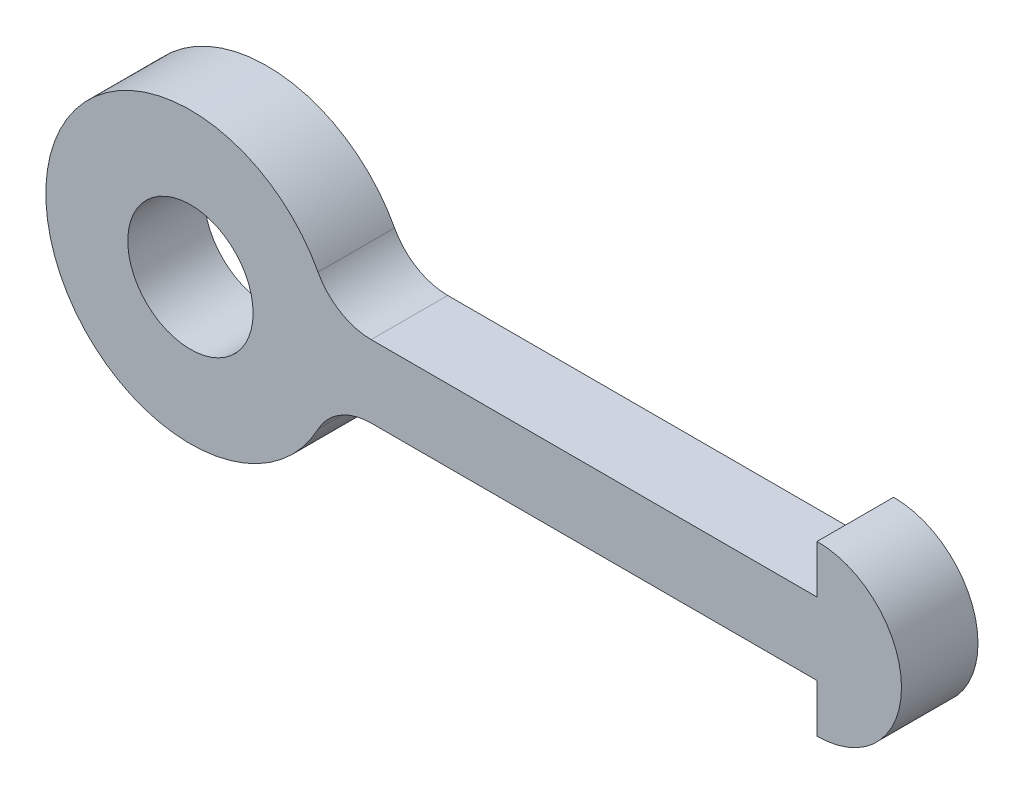
ISO-10303-21;
HEADER;
FILE_DESCRIPTION(('STEP AP214'),'2;1');
FILE_NAME('part.step','',(''),(''),'','','');
FILE_SCHEMA(('AUTOMOTIVE_DESIGN { 1 0 10303 214 1 1 1 1 }'));
ENDSEC;
DATA;
#1=APPLICATION_CONTEXT('core data for automotive mechanical design processes');
#2=APPLICATION_PROTOCOL_DEFINITION('international standard','automotive_design',2000,#1);
#3=PRODUCT_CONTEXT('',#1,'mechanical');
#4=PRODUCT('Part','Part','',(#3));
#5=PRODUCT_RELATED_PRODUCT_CATEGORY('part','',(#4));
#6=PRODUCT_DEFINITION_FORMATION('','',#4);
#7=PRODUCT_DEFINITION_CONTEXT('part definition',#1,'design');
#8=PRODUCT_DEFINITION('design','',#6,#7);
#9=PRODUCT_DEFINITION_SHAPE('','',#8);
#10=(LENGTH_UNIT() NAMED_UNIT(*) SI_UNIT(.MILLI.,.METRE.));
#11=(NAMED_UNIT(*) PLANE_ANGLE_UNIT() SI_UNIT($,.RADIAN.));
#12=(NAMED_UNIT(*) SI_UNIT($,.STERADIAN.) SOLID_ANGLE_UNIT());
#13=UNCERTAINTY_MEASURE_WITH_UNIT(LENGTH_MEASURE(1.E-05),#10,'distance_accuracy_value','');
#14=(GEOMETRIC_REPRESENTATION_CONTEXT(3) GLOBAL_UNCERTAINTY_ASSIGNED_CONTEXT((#13)) GLOBAL_UNIT_ASSIGNED_CONTEXT((#10,
#11,#12)) REPRESENTATION_CONTEXT('',''));
#15=CARTESIAN_POINT('',(0.,0.,0.));
#16=DIRECTION('',(0.,0.,1.));
#17=DIRECTION('',(1.,0.,0.));
#18=AXIS2_PLACEMENT_3D('',#15,#16,#17);
#19=CARTESIAN_POINT('',(10.,0.,1.5875));
#20=DIRECTION('',(1.,0.,0.));
#21=DIRECTION('',(0.,0.,-1.));
#22=AXIS2_PLACEMENT_3D('',#19,#20,#21);
#23=PLANE('',#22);
#24=DIRECTION('',(0.,-1.,0.));
#25=VECTOR('',#24,1.);
#26=CARTESIAN_POINT('',(10.,0.,-1.5875));
#27=LINE('',#26,#25);
#28=CARTESIAN_POINT('',(10.,3.5,-1.5875));
#29=VERTEX_POINT('',#28);
#30=CARTESIAN_POINT('',(10.,1.5,-1.5875));
#31=VERTEX_POINT('',#30);
#32=EDGE_CURVE('E131',#29,#31,#27,.T.);
#33=ORIENTED_EDGE('',*,*,#32,.T.);
#34=DIRECTION('',(0.,0.,-1.));
#35=VECTOR('',#34,1.);
#36=CARTESIAN_POINT('',(10.,1.5,1.5875));
#37=LINE('',#36,#35);
#38=CARTESIAN_POINT('',(10.,1.5,1.5875));
#39=VERTEX_POINT('',#38);
#40=EDGE_CURVE('E110',#39,#31,#37,.T.);
#41=ORIENTED_EDGE('',*,*,#40,.F.);
#42=DIRECTION('',(0.,-1.,0.));
#43=VECTOR('',#42,1.);
#44=CARTESIAN_POINT('',(10.,0.,1.5875));
#45=LINE('',#44,#43);
#46=CARTESIAN_POINT('',(10.,3.5,1.5875));
#47=VERTEX_POINT('',#46);
#48=EDGE_CURVE('E116',#47,#39,#45,.T.);
#49=ORIENTED_EDGE('',*,*,#48,.F.);
#50=DIRECTION('',(0.,0.,-1.));
#51=VECTOR('',#50,1.);
#52=CARTESIAN_POINT('',(10.,3.5,1.5875));
#53=LINE('',#52,#51);
#54=EDGE_CURVE('E208',#47,#29,#53,.T.);
#55=ORIENTED_EDGE('',*,*,#54,.T.);
#56=EDGE_LOOP('',(#33,#41,#49,#55));
#57=FACE_BOUND('',#56,.T.);
#58=ADVANCED_FACE('F41',(#57),#23,.F.);
#59=CARTESIAN_POINT('',(0.,1.5,1.5875));
#60=DIRECTION('',(0.,1.,0.));
#61=DIRECTION('',(0.,0.,1.));
#62=AXIS2_PLACEMENT_3D('',#59,#60,#61);
#63=PLANE('',#62);
#64=DIRECTION('',(1.,0.,0.));
#65=VECTOR('',#64,1.);
#66=CARTESIAN_POINT('',(0.,1.5,-1.5875));
#67=LINE('',#66,#65);
#68=CARTESIAN_POINT('',(-8.5,1.5,-1.5875));
#69=VERTEX_POINT('',#68);
#70=EDGE_CURVE('E222',#69,#31,#67,.T.);
#71=ORIENTED_EDGE('',*,*,#70,.F.);
#72=DIRECTION('',(0.,0.,-1.));
#73=VECTOR('',#72,1.);
#74=CARTESIAN_POINT('',(-8.5,1.5,1.5875));
#75=LINE('',#74,#73);
#76=CARTESIAN_POINT('',(-8.5,1.5,1.5875));
#77=VERTEX_POINT('',#76);
#78=EDGE_CURVE('E112',#69,#77,#75,.F.);
#79=ORIENTED_EDGE('',*,*,#78,.T.);
#80=DIRECTION('',(1.,0.,0.));
#81=VECTOR('',#80,1.);
#82=CARTESIAN_POINT('',(0.,1.5,1.5875));
#83=LINE('',#82,#81);
#84=EDGE_CURVE('E106',#77,#39,#83,.T.);
#85=ORIENTED_EDGE('',*,*,#84,.T.);
#86=ORIENTED_EDGE('',*,*,#40,.T.);
#87=EDGE_LOOP('',(#71,#79,#85,#86));
#88=FACE_BOUND('',#87,.T.);
#89=ADVANCED_FACE('F108',(#88),#63,.T.);
#90=CARTESIAN_POINT('',(0.,-1.5,1.5875));
#91=DIRECTION('',(0.,1.,0.));
#92=DIRECTION('',(0.,0.,1.));
#93=AXIS2_PLACEMENT_3D('',#90,#91,#92);
#94=PLANE('',#93);
#95=DIRECTION('',(1.,0.,0.));
#96=VECTOR('',#95,1.);
#97=CARTESIAN_POINT('',(0.,-1.5,1.5875));
#98=LINE('',#97,#96);
#99=CARTESIAN_POINT('',(-8.5,-1.5,1.5875));
#100=VERTEX_POINT('',#99);
#101=CARTESIAN_POINT('',(10.,-1.5,1.5875));
#102=VERTEX_POINT('',#101);
#103=EDGE_CURVE('E115',#100,#102,#98,.T.);
#104=ORIENTED_EDGE('',*,*,#103,.F.);
#105=DIRECTION('',(0.,0.,1.));
#106=VECTOR('',#105,1.);
#107=CARTESIAN_POINT('',(-8.5,-1.5,1.5875));
#108=LINE('',#107,#106);
#109=CARTESIAN_POINT('',(-8.5,-1.5,-1.5875));
#110=VERTEX_POINT('',#109);
#111=EDGE_CURVE('E148',#100,#110,#108,.F.);
#112=ORIENTED_EDGE('',*,*,#111,.T.);
#113=DIRECTION('',(1.,0.,0.));
#114=VECTOR('',#113,1.);
#115=CARTESIAN_POINT('',(0.,-1.5,-1.5875));
#116=LINE('',#115,#114);
#117=CARTESIAN_POINT('',(10.,-1.5,-1.5875));
#118=VERTEX_POINT('',#117);
#119=EDGE_CURVE('E205',#110,#118,#116,.T.);
#120=ORIENTED_EDGE('',*,*,#119,.T.);
#121=DIRECTION('',(0.,0.,-1.));
#122=VECTOR('',#121,1.);
#123=CARTESIAN_POINT('',(10.,-1.5,1.5875));
#124=LINE('',#123,#122);
#125=EDGE_CURVE('E134',#102,#118,#124,.T.);
#126=ORIENTED_EDGE('',*,*,#125,.F.);
#127=EDGE_LOOP('',(#104,#112,#120,#126));
#128=FACE_BOUND('',#127,.T.);
#129=ADVANCED_FACE('F183',(#128),#94,.F.);
#130=CARTESIAN_POINT('',(10.,-3.5,-1.5875));
#131=VERTEX_POINT('',#130);
#132=EDGE_CURVE('E198',#118,#131,#27,.T.);
#133=ORIENTED_EDGE('',*,*,#132,.T.);
#134=DIRECTION('',(0.,0.,-1.));
#135=VECTOR('',#134,1.);
#136=CARTESIAN_POINT('',(10.,-3.5,1.5875));
#137=LINE('',#136,#135);
#138=CARTESIAN_POINT('',(10.,-3.5,1.5875));
#139=VERTEX_POINT('',#138);
#140=EDGE_CURVE('E141',#139,#131,#137,.T.);
#141=ORIENTED_EDGE('',*,*,#140,.F.);
#142=EDGE_CURVE('E129',#102,#139,#45,.T.);
#143=ORIENTED_EDGE('',*,*,#142,.F.);
#144=ORIENTED_EDGE('',*,*,#125,.T.);
#145=EDGE_LOOP('',(#133,#141,#143,#144));
#146=FACE_BOUND('',#145,.T.);
#147=ADVANCED_FACE('F179',(#146),#23,.F.);
#148=CARTESIAN_POINT('',(9.99999999999999,0.,1.5875));
#149=DIRECTION('',(0.,0.,-1.));
#150=DIRECTION('',(-1.,0.,0.));
#151=AXIS2_PLACEMENT_3D('',#148,#149,#150);
#152=CYLINDRICAL_SURFACE('',#151,3.5);
#153=CARTESIAN_POINT('',(9.99999999999999,0.,-1.5875));
#154=DIRECTION('',(0.,0.,1.));
#155=DIRECTION('',(1.,0.,0.));
#156=AXIS2_PLACEMENT_3D('',#153,#154,#155);
#157=CIRCLE('',#156,3.5);
#158=EDGE_CURVE('E127',#131,#29,#157,.T.);
#159=ORIENTED_EDGE('',*,*,#158,.T.);
#160=ORIENTED_EDGE('',*,*,#54,.F.);
#161=CARTESIAN_POINT('',(9.99999999999999,0.,1.5875));
#162=DIRECTION('',(0.,0.,1.));
#163=DIRECTION('',(1.,0.,0.));
#164=AXIS2_PLACEMENT_3D('',#161,#162,#163);
#165=CIRCLE('',#164,3.5);
#166=EDGE_CURVE('E122',#139,#47,#165,.T.);
#167=ORIENTED_EDGE('',*,*,#166,.F.);
#168=ORIENTED_EDGE('',*,*,#140,.T.);
#169=EDGE_LOOP('',(#159,#160,#167,#168));
#170=FACE_BOUND('',#169,.T.);
#171=ADVANCED_FACE('F188',(#170),#152,.T.);
#172=CARTESIAN_POINT('',(0.,0.,1.5875));
#173=DIRECTION('',(0.,0.,1.));
#174=DIRECTION('',(1.,0.,0.));
#175=AXIS2_PLACEMENT_3D('',#172,#173,#174);
#176=PLANE('',#175);
#177=ORIENTED_EDGE('',*,*,#84,.F.);
#178=CARTESIAN_POINT('',(-8.5,4.,1.5875));
#179=DIRECTION('',(0.,0.,1.));
#180=DIRECTION('',(1.,0.,0.));
#181=AXIS2_PLACEMENT_3D('',#178,#179,#180);
#182=CIRCLE('',#181,2.5);
#183=CARTESIAN_POINT('',(-10.7058823529412,2.82352941176471,1.5875));
#184=VERTEX_POINT('',#183);
#185=EDGE_CURVE('E50',#77,#184,#182,.F.);
#186=ORIENTED_EDGE('',*,*,#185,.T.);
#187=CARTESIAN_POINT('',(-16.,0.,1.5875));
#188=DIRECTION('',(0.,0.,1.));
#189=DIRECTION('',(1.,0.,0.));
#190=AXIS2_PLACEMENT_3D('',#187,#188,#189);
#191=CIRCLE('',#190,6.);
#192=CARTESIAN_POINT('',(-10.7058823529412,-2.82352941176471,1.5875));
#193=VERTEX_POINT('',#192);
#194=EDGE_CURVE('E161',#184,#193,#191,.T.);
#195=ORIENTED_EDGE('',*,*,#194,.T.);
#196=CARTESIAN_POINT('',(-8.5,-4.,1.5875));
#197=DIRECTION('',(0.,0.,1.));
#198=DIRECTION('',(1.,0.,0.));
#199=AXIS2_PLACEMENT_3D('',#196,#197,#198);
#200=CIRCLE('',#199,2.5);
#201=EDGE_CURVE('E153',#193,#100,#200,.F.);
#202=ORIENTED_EDGE('',*,*,#201,.T.);
#203=ORIENTED_EDGE('',*,*,#103,.T.);
#204=ORIENTED_EDGE('',*,*,#142,.T.);
#205=ORIENTED_EDGE('',*,*,#166,.T.);
#206=ORIENTED_EDGE('',*,*,#48,.T.);
#207=EDGE_LOOP('',(#177,#186,#195,#202,#203,#204,#205,#206));
#208=FACE_BOUND('',#207,.T.);
#209=CARTESIAN_POINT('',(-16.,0.,1.5875));
#210=DIRECTION('',(0.,0.,1.));
#211=DIRECTION('',(1.,0.,0.));
#212=AXIS2_PLACEMENT_3D('',#209,#210,#211);
#213=CIRCLE('',#212,2.6);
#214=CARTESIAN_POINT('',(-13.4,0.,1.5875));
#215=VERTEX_POINT('',#214);
#216=EDGE_CURVE('E232',#215,#215,#213,.T.);
#217=ORIENTED_EDGE('',*,*,#216,.F.);
#218=EDGE_LOOP('',(#217));
#219=FACE_BOUND('',#218,.T.);
#220=ADVANCED_FACE('F119',(#208,#219),#176,.T.);
#221=CARTESIAN_POINT('',(0.,0.,-1.5875));
#222=DIRECTION('',(0.,0.,1.));
#223=DIRECTION('',(1.,0.,0.));
#224=AXIS2_PLACEMENT_3D('',#221,#222,#223);
#225=PLANE('',#224);
#226=CARTESIAN_POINT('',(-16.,0.,-1.5875));
#227=DIRECTION('',(0.,0.,1.));
#228=DIRECTION('',(1.,0.,0.));
#229=AXIS2_PLACEMENT_3D('',#226,#227,#228);
#230=CIRCLE('',#229,6.);
#231=CARTESIAN_POINT('',(-10.7058823529412,2.82352941176471,-1.5875));
#232=VERTEX_POINT('',#231);
#233=CARTESIAN_POINT('',(-10.7058823529412,-2.82352941176471,-1.5875));
#234=VERTEX_POINT('',#233);
#235=EDGE_CURVE('E167',#232,#234,#230,.T.);
#236=ORIENTED_EDGE('',*,*,#235,.F.);
#237=CARTESIAN_POINT('',(-8.5,4.,-1.5875));
#238=DIRECTION('',(0.,0.,1.));
#239=DIRECTION('',(1.,0.,0.));
#240=AXIS2_PLACEMENT_3D('',#237,#238,#239);
#241=CIRCLE('',#240,2.5);
#242=EDGE_CURVE('E11',#232,#69,#241,.T.);
#243=ORIENTED_EDGE('',*,*,#242,.T.);
#244=ORIENTED_EDGE('',*,*,#70,.T.);
#245=ORIENTED_EDGE('',*,*,#32,.F.);
#246=ORIENTED_EDGE('',*,*,#158,.F.);
#247=ORIENTED_EDGE('',*,*,#132,.F.);
#248=ORIENTED_EDGE('',*,*,#119,.F.);
#249=CARTESIAN_POINT('',(-8.5,-4.,-1.5875));
#250=DIRECTION('',(0.,0.,1.));
#251=DIRECTION('',(1.,0.,0.));
#252=AXIS2_PLACEMENT_3D('',#249,#250,#251);
#253=CIRCLE('',#252,2.5);
#254=EDGE_CURVE('E156',#110,#234,#253,.T.);
#255=ORIENTED_EDGE('',*,*,#254,.T.);
#256=EDGE_LOOP('',(#236,#243,#244,#245,#246,#247,#248,#255));
#257=FACE_BOUND('',#256,.T.);
#258=CARTESIAN_POINT('',(-16.,0.,-1.5875));
#259=DIRECTION('',(0.,0.,1.));
#260=DIRECTION('',(1.,0.,0.));
#261=AXIS2_PLACEMENT_3D('',#258,#259,#260);
#262=CIRCLE('',#261,2.6);
#263=CARTESIAN_POINT('',(-13.4,0.,-1.5875));
#264=VERTEX_POINT('',#263);
#265=EDGE_CURVE('E168',#264,#264,#262,.T.);
#266=ORIENTED_EDGE('',*,*,#265,.T.);
#267=EDGE_LOOP('',(#266));
#268=FACE_BOUND('',#267,.T.);
#269=ADVANCED_FACE('F209',(#257,#268),#225,.F.);
#270=CARTESIAN_POINT('',(-16.,0.,-1.5875));
#271=DIRECTION('',(0.,0.,1.));
#272=DIRECTION('',(1.,0.,0.));
#273=AXIS2_PLACEMENT_3D('',#270,#271,#272);
#274=CYLINDRICAL_SURFACE('',#273,6.);
#275=ORIENTED_EDGE('',*,*,#235,.T.);
#276=DIRECTION('',(0.,0.,1.));
#277=VECTOR('',#276,1.);
#278=CARTESIAN_POINT('',(-10.7058823529412,-2.82352941176471,-1.5875));
#279=LINE('',#278,#277);
#280=EDGE_CURVE('E138',#234,#193,#279,.T.);
#281=ORIENTED_EDGE('',*,*,#280,.T.);
#282=ORIENTED_EDGE('',*,*,#194,.F.);
#283=DIRECTION('',(0.,0.,1.));
#284=VECTOR('',#283,1.);
#285=CARTESIAN_POINT('',(-10.7058823529412,2.82352941176471,-1.5875));
#286=LINE('',#285,#284);
#287=EDGE_CURVE('E133',#184,#232,#286,.F.);
#288=ORIENTED_EDGE('',*,*,#287,.T.);
#289=EDGE_LOOP('',(#275,#281,#282,#288));
#290=FACE_BOUND('',#289,.T.);
#291=ADVANCED_FACE('F164',(#290),#274,.T.);
#292=CARTESIAN_POINT('',(-16.,0.,-1.5875));
#293=DIRECTION('',(0.,0.,1.));
#294=DIRECTION('',(1.,0.,0.));
#295=AXIS2_PLACEMENT_3D('',#292,#293,#294);
#296=CYLINDRICAL_SURFACE('',#295,2.6);
#297=ORIENTED_EDGE('',*,*,#265,.F.);
#298=EDGE_LOOP('',(#297));
#299=FACE_BOUND('',#298,.T.);
#300=ORIENTED_EDGE('',*,*,#216,.T.);
#301=EDGE_LOOP('',(#300));
#302=FACE_BOUND('',#301,.T.);
#303=ADVANCED_FACE('F175',(#299,#302),#296,.F.);
#304=CARTESIAN_POINT('',(-8.5,-4.,-1.5875));
#305=DIRECTION('',(0.,0.,1.));
#306=DIRECTION('',(1.,0.,0.));
#307=AXIS2_PLACEMENT_3D('',#304,#305,#306);
#308=CYLINDRICAL_SURFACE('',#307,2.5);
#309=ORIENTED_EDGE('',*,*,#254,.F.);
#310=ORIENTED_EDGE('',*,*,#111,.F.);
#311=ORIENTED_EDGE('',*,*,#201,.F.);
#312=ORIENTED_EDGE('',*,*,#280,.F.);
#313=EDGE_LOOP('',(#309,#310,#311,#312));
#314=FACE_BOUND('',#313,.T.);
#315=ADVANCED_FACE('F171',(#314),#308,.F.);
#316=CARTESIAN_POINT('',(-8.5,4.,-1.5875));
#317=DIRECTION('',(0.,0.,1.));
#318=DIRECTION('',(1.,0.,0.));
#319=AXIS2_PLACEMENT_3D('',#316,#317,#318);
#320=CYLINDRICAL_SURFACE('',#319,2.5);
#321=ORIENTED_EDGE('',*,*,#242,.F.);
#322=ORIENTED_EDGE('',*,*,#287,.F.);
#323=ORIENTED_EDGE('',*,*,#185,.F.);
#324=ORIENTED_EDGE('',*,*,#78,.F.);
#325=EDGE_LOOP('',(#321,#322,#323,#324));
#326=FACE_BOUND('',#325,.T.);
#327=ADVANCED_FACE('F43',(#326),#320,.F.);
#328=CLOSED_SHELL('',(#58,#89,#129,#147,#171,#220,#269,#291,#303,#315,#327));
#329=MANIFOLD_SOLID_BREP('B2',#328);
#330=ADVANCED_BREP_SHAPE_REPRESENTATION('',(#18,#329),#14);
#331=SHAPE_DEFINITION_REPRESENTATION(#9,#330);
ENDSEC;
END-ISO-10303-21;
